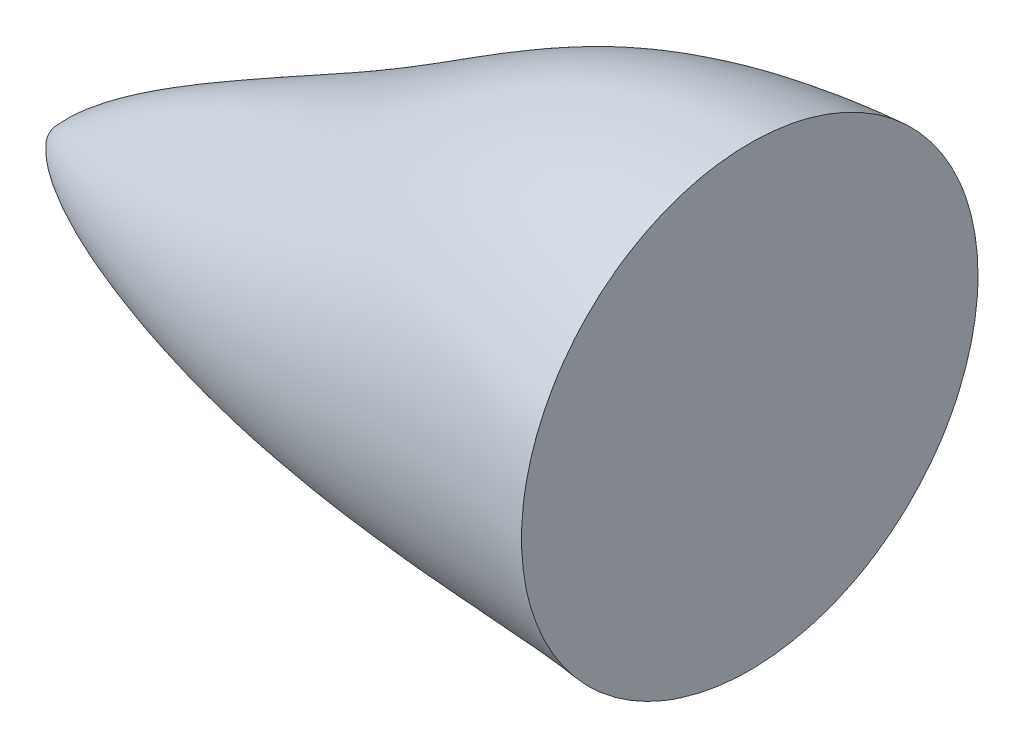
ISO-10303-21;
HEADER;
FILE_DESCRIPTION(('STEP AP214'),'2;1');
FILE_NAME('part.step','',(''),(''),'','','');
FILE_SCHEMA(('AUTOMOTIVE_DESIGN { 1 0 10303 214 1 1 1 1 }'));
ENDSEC;
DATA;
#1=APPLICATION_CONTEXT('core data for automotive mechanical design processes');
#2=APPLICATION_PROTOCOL_DEFINITION('international standard','automotive_design',2000,#1);
#3=PRODUCT_CONTEXT('',#1,'mechanical');
#4=PRODUCT('Part','Part','',(#3));
#5=PRODUCT_RELATED_PRODUCT_CATEGORY('part','',(#4));
#6=PRODUCT_DEFINITION_FORMATION('','',#4);
#7=PRODUCT_DEFINITION_CONTEXT('part definition',#1,'design');
#8=PRODUCT_DEFINITION('design','',#6,#7);
#9=PRODUCT_DEFINITION_SHAPE('','',#8);
#10=(LENGTH_UNIT() NAMED_UNIT(*) SI_UNIT(.MILLI.,.METRE.));
#11=(NAMED_UNIT(*) PLANE_ANGLE_UNIT() SI_UNIT($,.RADIAN.));
#12=(NAMED_UNIT(*) SI_UNIT($,.STERADIAN.) SOLID_ANGLE_UNIT());
#13=UNCERTAINTY_MEASURE_WITH_UNIT(LENGTH_MEASURE(1.E-05),#10,'distance_accuracy_value','');
#14=(GEOMETRIC_REPRESENTATION_CONTEXT(3) GLOBAL_UNCERTAINTY_ASSIGNED_CONTEXT((#13)) GLOBAL_UNIT_ASSIGNED_CONTEXT((#10,
#11,#12)) REPRESENTATION_CONTEXT('',''));
#15=CARTESIAN_POINT('',(0.,0.,0.));
#16=DIRECTION('',(0.,0.,1.));
#17=DIRECTION('',(1.,0.,0.));
#18=AXIS2_PLACEMENT_3D('',#15,#16,#17);
#19=CARTESIAN_POINT('',(252.505080353612,41.444975046652,-0.0242900524774977));
#20=DIRECTION('',(1.,0.,0.));
#21=DIRECTION('',(0.,0.,-1.));
#22=AXIS2_PLACEMENT_3D('',#19,#20,#21);
#23=PLANE('',#22);
#24=CARTESIAN_POINT('',(252.505080353612,41.444975046652,-0.0242900524774977));
#25=DIRECTION('',(1.,0.,0.));
#26=DIRECTION('',(0.,0.,-1.));
#27=AXIS2_PLACEMENT_3D('',#24,#25,#26);
#28=CIRCLE('',#27,80.2554933957984);
#29=CARTESIAN_POINT('',(252.505080353612,41.444975046652,-80.2797834482759));
#30=VERTEX_POINT('',#29);
#31=EDGE_CURVE('E12',#30,#30,#28,.T.);
#32=ORIENTED_EDGE('',*,*,#31,.T.);
#33=EDGE_LOOP('',(#32));
#34=FACE_BOUND('',#33,.T.);
#35=ADVANCED_FACE('F133',(#34),#23,.T.);
#36=CARTESIAN_POINT('',(14.0004930090321,1.55127443899315,-0.0242900524774881));
#37=DIRECTION('',(0.,0.,1.));
#38=DIRECTION('',(1.,0.,0.));
#39=AXIS2_PLACEMENT_3D('',#36,#37,#38);
#40=SPHERICAL_SURFACE('',#39,6.4149126554202);
#41=CARTESIAN_POINT('',(8.79208035361189,5.29607643476394,-0.0242900526618124));
#42=CARTESIAN_POINT('',(8.79208035361189,5.29607643476394,0.207305923801027));
#43=CARTESIAN_POINT('',(8.79208035361189,5.25264392995722,0.672071970209962));
#44=CARTESIAN_POINT('',(8.79208035361189,5.05907018495237,1.34952014911492));
#45=CARTESIAN_POINT('',(8.79208035361189,4.7389439787782,1.98284426504728));
#46=CARTESIAN_POINT('',(8.79208035361189,4.30350541356575,2.54901666698464));
#47=CARTESIAN_POINT('',(8.79208035361189,3.7639945914461,3.02500970390461));
#48=CARTESIAN_POINT('',(8.79208035361189,3.14013352681816,3.39289606316121));
#49=CARTESIAN_POINT('',(8.79208035361189,2.45164423408082,3.63474843210848));
#50=CARTESIAN_POINT('',(8.79208035361189,1.7246318865398,3.74093525600894));
#51=CARTESIAN_POINT('',(8.79208035361189,0.985201657500788,3.70182498012511));
#52=CARTESIAN_POINT('',(8.79208035361189,0.262431618430225,3.51851168750138));
#53=CARTESIAN_POINT('',(8.79208035361189,-0.414600159205438,3.19208946118217));
#54=CARTESIAN_POINT('',(8.79208035361189,-1.01834135006838,2.73532466143962));
#55=CARTESIAN_POINT('',(8.79208035361189,-1.52123962882078,2.16098364854588));
#56=CARTESIAN_POINT('',(8.79208035361189,-1.90181182807983,1.49271054716355));
#57=CARTESIAN_POINT('',(8.79208035361189,-2.13857478046271,0.754149481955265));
#58=CARTESIAN_POINT('',(8.79208035361189,-2.19352755677765,0.235978873552011));
#59=CARTESIAN_POINT('',(8.79208035361189,-2.19352755677765,-0.131666199893094));
#60=CARTESIAN_POINT('',(8.79208035361189,-2.18431323087303,-0.351624013182471));
#61=CARTESIAN_POINT('',(8.79208035361189,-2.13882265346838,-0.694097399983987));
#62=CARTESIAN_POINT('',(8.79208035361189,-2.05763687668219,-1.04602756514592));
#63=CARTESIAN_POINT('',(8.79208035361189,-1.89824610496449,-1.51994789294096));
#64=CARTESIAN_POINT('',(8.79208035361189,-1.59645912876083,-2.10625676020547));
#65=CARTESIAN_POINT('',(8.79208035361189,-1.07482462322609,-2.73486082252649));
#66=CARTESIAN_POINT('',(8.79208035361189,-0.440461498602304,-3.22815136226369));
#67=CARTESIAN_POINT('',(8.79208035361189,0.132552549983909,-3.5044893635251));
#68=CARTESIAN_POINT('',(8.79208035361189,0.585240357892667,-3.64795785868511));
#69=CARTESIAN_POINT('',(8.79208035361189,0.918625788228482,-3.7202835226138));
#70=CARTESIAN_POINT('',(8.79208035361189,1.2426120828529,-3.76085872458442));
#71=CARTESIAN_POINT('',(8.79208035361189,1.45015771538447,-3.76909204824829));
#72=CARTESIAN_POINT('',(8.79208035361189,1.83923442354722,-3.76909204824829));
#73=CARTESIAN_POINT('',(8.79208035361189,2.24240224192039,-3.72057843206245));
#74=CARTESIAN_POINT('',(8.79208035361189,2.7314976301406,-3.58471430635205));
#75=CARTESIAN_POINT('',(8.79208035361189,3.07522602557911,-3.45097329876752));
#76=CARTESIAN_POINT('',(8.79208035361189,3.39699898103635,-3.28913611664418));
#77=CARTESIAN_POINT('',(8.79208035361189,3.69649676759718,-3.1008397258113));
#78=CARTESIAN_POINT('',(8.79208035361189,3.97339965634645,-2.88772109209817));
#79=CARTESIAN_POINT('',(8.79208035361189,4.22738791836901,-2.6514171813341));
#80=CARTESIAN_POINT('',(8.79208035361189,4.45814182474972,-2.39356495934836));
#81=CARTESIAN_POINT('',(8.79208035361189,4.66454621770773,-2.11481001349433));
#82=CARTESIAN_POINT('',(8.79208035361189,4.84548593946219,-1.81579793112538));
#83=CARTESIAN_POINT('',(8.79208035361189,4.99984583223226,-1.49717429959488));
#84=CARTESIAN_POINT('',(8.79208035361189,5.12651073823709,-1.15958470625621));
#85=CARTESIAN_POINT('',(8.79208035361189,5.25351522183546,-0.683481160733875));
#86=CARTESIAN_POINT('',(8.79208035361189,5.29607643476394,-0.296388246895156));
#87=CARTESIAN_POINT('',(8.79208035361189,5.29607643476394,-0.0242900526618124));
#88=B_SPLINE_CURVE_WITH_KNOTS('',3,(#41,#42,#43,#44,#45,#46,#47,#48,#49,#50,#51,#52,#53,#54,#55,
#56,#57,#58,#59,#60,#61,#62,#63,#64,#65,#66,#67,#68,#69,#70,#71,#72,#73,#74,#75,#76,#77,#78,#79,
#80,#81,#82,#83,#84,#85,#86,#87),.UNSPECIFIED.,.T.,.F.,(4,1,1,1,1,1,1,1,1,1,1,1,1,1,1,1,2,1,1,1,
1,1,1,1,1,1,1,1,2,1,1,1,1,1,1,1,1,1,1,1,1,1,4),(0.,0.03125,0.0625,0.09375,0.125,0.15625,0.1875,
0.21875,0.25,0.28125,0.3125,0.34375,0.375,0.40625,0.4375,0.46875,0.5,0.512892451868856,
0.525784903737711,0.538677355606566,0.551569807475422,0.577354711213133,0.603139614950844,
0.628924518688555,0.654709422426266,0.667601874295122,0.680494326163977,0.693386778032833,
0.706279229901688,0.742994326163977,0.761351874295122,0.779709422426266,0.798066970557411,
0.816424518688555,0.8347820668197,0.853139614950844,0.871497163081989,0.889854711213133,
0.908212259344278,0.926569807475422,0.944927355606566,0.963284903737711,1.),.UNSPECIFIED.);
#89=CARTESIAN_POINT('',(8.79208035361189,1.55127443899315,-3.76909204824828));
#90=VERTEX_POINT('',#89);
#91=EDGE_CURVE('E143',#90,#90,#88,.T.);
#92=ORIENTED_EDGE('',*,*,#91,.F.);
#93=EDGE_LOOP('',(#92));
#94=FACE_BOUND('',#93,.T.);
#95=ADVANCED_FACE('F135',(#94),#40,.T.);
#96=CARTESIAN_POINT('',(8.79208035361189,5.29607643476394,-0.0242900526618124));
#97=CARTESIAN_POINT('',(22.0368216485564,20.1589542808384,-0.0242900524774881));
#98=CARTESIAN_POINT('',(54.6969178632129,39.2214785691004,-0.0242900524774881));
#99=CARTESIAN_POINT('',(91.0414597487698,56.8834706932842,-0.0242900524774881));
#100=CARTESIAN_POINT('',(106.021679072452,65.2347902173201,-0.0242900524774881));
#101=CARTESIAN_POINT('',(113.387790407563,69.4475607139392,-0.0242900524774881));
#102=CARTESIAN_POINT('',(128.983395481641,78.9700152689198,-0.0242900524774881));
#103=CARTESIAN_POINT('',(168.821290164312,104.734654201333,-0.0242900524774881));
#104=CARTESIAN_POINT('',(207.221534267085,121.81733907754,-0.0242900524774881));
#105=CARTESIAN_POINT('',(252.505080353612,121.70046844245,-0.0242900501067162));
#106=CARTESIAN_POINT('',(8.79208035361189,5.29607643476394,0.207305923801027));
#107=CARTESIAN_POINT('',(22.0368216485564,20.1589542808384,0.856432173165849));
#108=CARTESIAN_POINT('',(54.6969178632129,39.2214785691004,1.91126232808416));
#109=CARTESIAN_POINT('',(91.0414597487698,56.8834706932842,2.83414136751602));
#110=CARTESIAN_POINT('',(106.021679072452,65.2347902173201,3.20018250892833));
#111=CARTESIAN_POINT('',(113.387790407563,69.4475607139392,3.37855678942398));
#112=CARTESIAN_POINT('',(128.983395481641,78.9700152689198,3.7471938365309));
#113=CARTESIAN_POINT('',(168.821290164312,104.734654201333,4.60277571386178));
#114=CARTESIAN_POINT('',(207.221534267085,121.81733907754,5.10806134963034));
#115=CARTESIAN_POINT('',(252.505080353612,121.70046844245,5.48702557882752));
#116=CARTESIAN_POINT('',(8.79208035361189,5.25264392995722,0.672071970209962));
#117=CARTESIAN_POINT('',(21.9745662186552,19.9721168974318,2.6193077508435));
#118=CARTESIAN_POINT('',(54.6017836578803,38.839515431797,5.78356589407439));
#119=CARTESIAN_POINT('',(91.0036213619518,56.3242085306763,8.55021189977591));
#120=CARTESIAN_POINT('',(106.023486505561,64.5957796751024,9.64691381559775));
#121=CARTESIAN_POINT('',(113.410585249944,68.7686826622384,10.1812753535273));
#122=CARTESIAN_POINT('',(129.058063982592,78.2033052992709,11.2852158138743));
#123=CARTESIAN_POINT('',(169.044536058193,103.740318396779,13.8450581880084));
#124=CARTESIAN_POINT('',(207.471584337231,120.684102269237,15.3520020720883));
#125=CARTESIAN_POINT('',(252.505080353612,120.561344174218,16.4822099874981));
#126=CARTESIAN_POINT('',(8.79208035361189,5.05907018495237,1.34952014911492));
#127=CARTESIAN_POINT('',(21.7177625703131,19.1458042609468,5.16887569790878));
#128=CARTESIAN_POINT('',(54.2093550608844,37.141369188698,11.375328464404));
#129=CARTESIAN_POINT('',(90.847538016329,53.8389015665697,16.791644388973));
#130=CARTESIAN_POINT('',(106.030942167136,61.7603545291913,18.9350541057037));
#131=CARTESIAN_POINT('',(113.504613974767,65.758600566734,19.9790240815795));
#132=CARTESIAN_POINT('',(129.366071549019,74.8104438102853,22.1334862261693));
#133=CARTESIAN_POINT('',(169.965425370454,99.3645857461761,27.1159234827189));
#134=CARTESIAN_POINT('',(208.503040876579,115.716944613887,30.0212146350584));
#135=CARTESIAN_POINT('',(252.505080353611,115.556056973447,32.2001830015763));
#136=CARTESIAN_POINT('',(8.79208035361189,4.7389439787782,1.98284426504728));
#137=CARTESIAN_POINT('',(21.3208842046931,17.803734327545,7.52735170795148));
#138=CARTESIAN_POINT('',(53.6028745018897,34.3802989317061,16.5371763023818));
#139=CARTESIAN_POINT('',(90.6063183003653,49.8034119777684,24.3828097334953));
#140=CARTESIAN_POINT('',(106.042464553206,57.1624923900701,27.481498947623));
#141=CARTESIAN_POINT('',(113.649931094945,60.8806265314003,28.9900861943824));
#142=CARTESIAN_POINT('',(129.842083242587,69.3209062695076,32.0995545224449));
#143=CARTESIAN_POINT('',(171.388617943947,92.3158643082401,39.2680423606834));
#144=CARTESIAN_POINT('',(210.097110073756,107.7433465084,43.4011344208346));
#145=CARTESIAN_POINT('',(252.505080353612,107.51538923442,46.5009534680777));
#146=CARTESIAN_POINT('',(8.79208035361189,4.30350541356575,2.54901666698464));
#147=CARTESIAN_POINT('',(20.8072769080087,15.9978537914122,9.60531987309426));
#148=CARTESIAN_POINT('',(52.8180173078974,30.6601843769101,21.071812582741));
#149=CARTESIAN_POINT('',(90.294151609119,44.373658694234,31.0318570428224));
#150=CARTESIAN_POINT('',(106.057375876356,50.9837483186931,34.9568350666284));
#151=CARTESIAN_POINT('',(113.83798854459,54.3293439916712,36.8667375638911));
#152=CARTESIAN_POINT('',(130.458098375439,61.959159926574,40.7978170810524));
#153=CARTESIAN_POINT('',(173.230396568468,82.9022816209228,49.8276762584372));
#154=CARTESIAN_POINT('',(212.160023152453,97.1337031660424,54.9655175050415));
#155=CARTESIAN_POINT('',(252.505080353611,96.819578817059,58.8188984419516));
#156=CARTESIAN_POINT('',(8.79208035361189,3.7639945914461,3.02500970390461));
#157=CARTESIAN_POINT('',(20.2002864664724,13.7935534216604,11.3218793793662));
#158=CARTESIAN_POINT('',(51.890458805906,26.1201959370805,24.8042926017187));
#159=CARTESIAN_POINT('',(89.9252273376458,37.7594174314587,36.4832448767874));
#160=CARTESIAN_POINT('',(106.074998349169,43.466704484781,41.0741486897068));
#161=CARTESIAN_POINT('',(114.060238257805,46.3638366251744,43.3068410406453));
#162=CARTESIAN_POINT('',(131.18611625972,53.021228302599,47.8950494037268));
#163=CARTESIAN_POINT('',(175.407044033811,71.5191844664792,58.3916418336382));
#164=CARTESIAN_POINT('',(214.59801133637,84.3533977163556,64.2744170419421));
#165=CARTESIAN_POINT('',(252.505080353612,83.9496780015402,68.6864984499226));
#166=CARTESIAN_POINT('',(8.79208035361189,3.14013352681816,3.39289606316121));
#167=CARTESIAN_POINT('',(19.5232586662973,11.2740905819311,12.6110431849215));
#168=CARTESIAN_POINT('',(50.8558743229156,20.932620728193,27.5905322575194));
#169=CARTESIAN_POINT('',(89.5137348810024,30.2162907314106,40.528123984819));
#170=CARTESIAN_POINT('',(106.09465418423,34.9045876543897,45.6001616987292));
#171=CARTESIAN_POINT('',(114.308132168699,37.2961561776547,48.0653508392501));
#172=CARTESIAN_POINT('',(131.998136207571,42.8607642616786,53.122677814462));
#173=CARTESIAN_POINT('',(177.83484312977,58.6295436178635,64.6414005194024));
#174=CARTESIAN_POINT('',(217.317305849199,69.9396294669143,70.9894231578317));
#175=CARTESIAN_POINT('',(252.505080353612,69.4616993865726,75.7504401381783));
#176=CARTESIAN_POINT('',(8.79208035361189,2.45164423408082,3.63474843210848));
#177=CARTESIAN_POINT('',(18.7995392936966,8.53188433890053,13.419902175697));
#178=CARTESIAN_POINT('',(49.7499391859264,15.2937953366884,29.3207770087766));
#179=CARTESIAN_POINT('',(89.0738636342463,22.035337088769,43.0117200673144));
#180=CARTESIAN_POINT('',(106.115665594123,25.6300326091471,48.3639096767347));
#181=CARTESIAN_POINT('',(114.573122211379,27.4796261643819,50.9635938776696));
#182=CARTESIAN_POINT('',(132.866157531137,31.8761843684211,56.2871459336486));
#183=CARTESIAN_POINT('',(180.430076646141,44.7470887271925,68.3549957624447));
#184=CARTESIAN_POINT('',(220.224137914637,54.479517987699,74.8845602050128));
#185=CARTESIAN_POINT('',(252.505080353612,53.9609468707034,79.7817335382199));
#186=CARTESIAN_POINT('',(8.79208035361189,1.7246318865398,3.74093525600894));
#187=CARTESIAN_POINT('',(18.0524741348827,5.67061251827797,13.7165056552835));
#188=CARTESIAN_POINT('',(48.608328721937,9.41923795824644,29.926807553864));
#189=CARTESIAN_POINT('',(88.6198029924329,13.5321651642088,43.8399058491239));
#190=CARTESIAN_POINT('',(106.137354791431,16.0018012344426,49.2630474058589));
#191=CARTESIAN_POINT('',(114.846660319952,17.2944056824115,51.8954437133567));
#192=CARTESIAN_POINT('',(133.762179542559,20.4938575366789,57.2758071193624));
#193=CARTESIAN_POINT('',(183.109027372717,30.4140569968097,69.4122358357684));
#194=CARTESIAN_POINT('',(223.22473875638,38.5847898259359,75.8509336056077));
#195=CARTESIAN_POINT('',(252.505080353612,38.0744058999903,80.6799569340167));
#196=CARTESIAN_POINT('',(8.79208035361189,0.985201657500788,3.70182498012511));
#197=CARTESIAN_POINT('',(17.3054089760688,2.79741064494501,13.4845744022803));
#198=CARTESIAN_POINT('',(47.4667182579476,3.53354324887389,29.3815422130528));
#199=CARTESIAN_POINT('',(88.1657423506196,5.0342693293441,42.9819434378197));
#200=CARTESIAN_POINT('',(106.159043988739,6.39091093189193,48.2674345922908));
#201=CARTESIAN_POINT('',(115.120198428525,7.13300872962664,50.8312735959864));
#202=CARTESIAN_POINT('',(134.65820155398,9.15224479152814,56.0613838073754));
#203=CARTESIAN_POINT('',(185.787978099293,16.1814230186761,67.7988458573003));
#204=CARTESIAN_POINT('',(226.225339598123,22.86822923764,73.8976228171726));
#205=CARTESIAN_POINT('',(252.505080353612,22.4243598686579,78.471705537855));
#206=CARTESIAN_POINT('',(8.79208035361189,0.262431618430225,3.51851168750138));
#207=CARTESIAN_POINT('',(16.581689603468,0.0219920557761141,12.7320585502368));
#208=CARTESIAN_POINT('',(46.3607831209584,-2.1367583384523,27.7040722019627));
#209=CARTESIAN_POINT('',(87.7258711038635,-3.13137160817288,40.4724453133659));
#210=CARTESIAN_POINT('',(106.180055398633,-2.83377649201879,45.4198802149974));
#211=CARTESIAN_POINT('',(115.385188471205,-2.61507798820823,47.8181082333009));
#212=CARTESIAN_POINT('',(135.526222877546,-1.71544158460178,52.7008963211129));
#213=CARTESIAN_POINT('',(188.383211615663,2.58729472142365,63.6025681970041));
#214=CARTESIAN_POINT('',(229.132171663561,7.92014334996818,69.1461321067786));
#215=CARTESIAN_POINT('',(252.505080353611,7.60340719292589,73.3038050396439));
#216=CARTESIAN_POINT('',(8.79208035361189,-0.414600159205438,3.19208946118217));
#217=CARTESIAN_POINT('',(15.9046618032929,-2.54877482529745,11.4827839812719));
#218=CARTESIAN_POINT('',(45.3261986379679,-7.37260424723108,24.9551625762086));
#219=CARTESIAN_POINT('',(87.31437864722,-10.6511351541591,36.4089628762583));
#220=CARTESIAN_POINT('',(106.199711233693,-11.319742585418,40.8341050784654));
#221=CARTESIAN_POINT('',(115.633082382099,-11.5782374619175,42.9777193069627));
#222=CARTESIAN_POINT('',(136.338242825397,-11.6974231716899,47.3337476467477));
#223=CARTESIAN_POINT('',(190.811010711623,-9.86232826603562,57.0095483595909));
#224=CARTESIAN_POINT('',(231.851466176391,-5.71256035471374,61.8222978080387));
#225=CARTESIAN_POINT('',(252.505080353612,-5.84772186458018,65.4318598946812));
#226=CARTESIAN_POINT('',(8.79208035361189,-1.01834135006838,2.73532466143962));
#227=CARTESIAN_POINT('',(15.2976713617567,-4.81507490042071,9.78448666788476));
#228=CARTESIAN_POINT('',(44.3986401359766,-11.9709675644527,21.239374928158));
#229=CARTESIAN_POINT('',(86.9454543757468,-17.2368349458739,30.9491155334055));
#230=CARTESIAN_POINT('',(106.217333706506,-18.7441783622788,34.6899533729851));
#231=CARTESIAN_POINT('',(115.855332095315,-19.4167037249652,36.5009094594995));
#232=CARTESIAN_POINT('',(137.066260709678,-20.4185411284423,40.1741301288329));
#233=CARTESIAN_POINT('',(192.987658176966,-20.7111421830181,48.2926172280757));
#234=CARTESIAN_POINT('',(234.289454360307,-17.54456332619,52.2426176950414));
#235=CARTESIAN_POINT('',(252.505080353612,-17.4588057713263,55.205118045368));
#236=CARTESIAN_POINT('',(8.79208035361189,-1.52123962882078,2.16098364854588));
#237=CARTESIAN_POINT('',(14.7840640650722,-6.68587957130097,7.6985195108074));
#238=CARTESIAN_POINT('',(43.6137829419842,-15.7518859384583,16.6970152867898));
#239=CARTESIAN_POINT('',(86.6332876845005,-22.636737050366,24.3033642043615));
#240=CARTESIAN_POINT('',(106.232245029656,-24.8263538694235,27.2260925243857));
#241=CARTESIAN_POINT('',(116.043389544959,-25.8355660962865,28.6401327006831));
#242=CARTESIAN_POINT('',(137.682275842531,-27.5544285404941,31.5032294261359));
#243=CARTESIAN_POINT('',(194.829436801487,-29.5685810104953,37.8010494938086));
#244=CARTESIAN_POINT('',(236.352367439005,-27.1675347413668,40.7994946641135));
#245=CARTESIAN_POINT('',(252.505080353612,-26.8450482110005,43.0483285417717));
#246=CARTESIAN_POINT('',(8.79208035361189,-1.90181182807983,1.49271054716355));
#247=CARTESIAN_POINT('',(14.3871856994523,-8.0860070527018,5.30617113257298));
#248=CARTESIAN_POINT('',(43.0073023829897,-18.567132520185,11.5030445836766));
#249=CARTESIAN_POINT('',(86.392067968537,-26.6453750620919,16.7278562473524));
#250=CARTESIAN_POINT('',(106.243767415726,-29.3377934492912,18.7305993717441));
#251=CARTESIAN_POINT('',(116.188706665138,-30.5951097871097,19.6989958449177));
#252=CARTESIAN_POINT('',(138.158287536098,-32.8421338428605,21.6565766375514));
#253=CARTESIAN_POINT('',(196.25262937498,-36.12075102179,25.9434694737301));
#254=CARTESIAN_POINT('',(237.946436636181,-34.2605329920634,27.9426421178506));
#255=CARTESIAN_POINT('',(252.505080353612,-33.7170797741251,29.4420216007367));
#256=CARTESIAN_POINT('',(8.79208035361189,-2.13857478046271,0.754149481955265));
#257=CARTESIAN_POINT('',(14.1303820511101,-8.95373661265602,2.69792191580472));
#258=CARTESIAN_POINT('',(42.6148737859935,-20.3038157254014,5.85655212062719));
#259=CARTESIAN_POINT('',(86.2359846229139,-29.1112840750204,8.51336024059382));
#260=CARTESIAN_POINT('',(106.251223077301,-32.1112598465995,9.52942371208681));
#261=CARTESIAN_POINT('',(116.28273538996,-33.5203669051262,10.020464453456));
#262=CARTESIAN_POINT('',(138.466295102525,-36.0905983664946,11.0115598753504));
#263=CARTESIAN_POINT('',(197.173518687241,-40.1416222056402,13.1728013750961));
#264=CARTESIAN_POINT('',(238.97789317553,-38.598636263349,14.1605498688448));
#265=CARTESIAN_POINT('',(252.505080353612,-37.8876679028486,14.9013612388657));
#266=CARTESIAN_POINT('',(8.79208035361189,-2.19352755677765,0.235978873552011));
#267=CARTESIAN_POINT('',(14.0681266212089,-9.15153290162613,0.883844856905754));
#268=CARTESIAN_POINT('',(42.519739580661,-20.695825548608,1.9366270796736));
#269=CARTESIAN_POINT('',(86.1981462360961,-29.6654686776614,2.82128415528785));
#270=CARTESIAN_POINT('',(106.25303051041,-32.7341316721994,3.15929197583481));
#271=CARTESIAN_POINT('',(116.305530232341,-34.1771664260303,3.32260774507428));
#272=CARTESIAN_POINT('',(138.540963603477,-36.8197704426047,3.65202785705499));
#273=CARTESIAN_POINT('',(197.396764581122,-41.0438740773254,4.36912399325872));
#274=CARTESIAN_POINT('',(239.227943245675,-39.5688234878882,4.69407988993723));
#275=CARTESIAN_POINT('',(252.505080353612,-38.8105183491463,4.9377968121345));
#276=CARTESIAN_POINT('',(8.79208035361189,-2.19352755677765,-0.131666199893094));
#277=CARTESIAN_POINT('',(14.0681266212089,-9.15153290162613,-0.398948791986319));
#278=CARTESIAN_POINT('',(42.519739580661,-20.695825548608,-0.833283004319797));
#279=CARTESIAN_POINT('',(86.1981462360961,-29.6654686776614,-1.19825576488938));
#280=CARTESIAN_POINT('',(106.25303051041,-32.7341316721994,-1.33770375073573));
#281=CARTESIAN_POINT('',(116.305530232341,-34.1771664260303,-1.40508105295476));
#282=CARTESIAN_POINT('',(138.540963603477,-36.8197704426047,-1.54098610698178));
#283=CARTESIAN_POINT('',(197.396764581122,-41.0438740773254,-1.83683018446495));
#284=CARTESIAN_POINT('',(239.227943245675,-39.5688234878882,-1.97089348870266));
#285=CARTESIAN_POINT('',(252.505080353612,-38.8105183491463,-2.07144096719256));
#286=CARTESIAN_POINT('',(8.79208035361189,-2.18431323087303,-0.351624013182471));
#287=CARTESIAN_POINT('',(14.1719297973805,-9.12293016923063,-1.16897980759839));
#288=CARTESIAN_POINT('',(42.6415617886513,-20.6330798439165,-2.47109709848756));
#289=CARTESIAN_POINT('',(86.2357548495017,-29.5715345770848,-3.54644817912673));
#290=CARTESIAN_POINT('',(106.251224492249,-32.628154292302,-3.95452427768742));
#291=CARTESIAN_POINT('',(116.283990838578,-34.0652555500797,-4.15121110928516));
#292=CARTESIAN_POINT('',(138.47686622839,-36.6962042558687,-4.54661017996767));
#293=CARTESIAN_POINT('',(197.234309799777,-40.9007360246316,-5.4073108224472));
#294=CARTESIAN_POINT('',(239.073557555498,-39.4203432600995,-5.76133415780867));
#295=CARTESIAN_POINT('',(252.505080353612,-38.6553128743962,-6.00319761880562));
#296=CARTESIAN_POINT('',(8.79208035361189,-2.13882265346838,-0.694097399983987));
#297=CARTESIAN_POINT('',(14.6001178990884,-8.98969538069406,-2.36829046557489));
#298=CARTESIAN_POINT('',(43.144078396611,-20.3465303158922,-4.95696623656659));
#299=CARTESIAN_POINT('',(86.3908903798001,-29.1518855128296,-7.04424357205201));
#300=CARTESIAN_POINT('',(106.243774667334,-32.1593305111035,-7.83034385808784));
#301=CARTESIAN_POINT('',(116.195140839306,-33.5724655299672,-8.20804648678141));
#302=CARTESIAN_POINT('',(138.212464556158,-36.1577869186629,-8.96488181946288));
#303=CARTESIAN_POINT('',(196.564183826732,-40.2946140249674,-10.62128842719));
#304=CARTESIAN_POINT('',(238.43671658352,-38.8168749393315,-11.2120206041908));
#305=CARTESIAN_POINT('',(252.505080353612,-38.0426205232851,-11.5338427779697));
#306=CARTESIAN_POINT('',(8.79208035361189,-2.05763687668219,-1.04602756514592));
#307=CARTESIAN_POINT('',(15.2618631471823,-8.76262286549907,-3.59536887052635));
#308=CARTESIAN_POINT('',(43.9206949725488,-19.8660215320782,-7.44526952581778));
#309=CARTESIAN_POINT('',(86.6306452902611,-28.4579396382162,-10.4941677853851));
#310=CARTESIAN_POINT('',(106.232261301556,-31.3886583579273,-11.6372731604955));
#311=CARTESIAN_POINT('',(116.057827204068,-32.7646792193199,-12.1853202392405));
#312=CARTESIAN_POINT('',(137.803843789982,-35.2807604333542,-13.2818181633259));
#313=CARTESIAN_POINT('',(195.52853459566,-39.3230553469651,-15.6992406760861));
#314=CARTESIAN_POINT('',(237.452507808642,-37.8727666633259,-16.4676439340448));
#315=CARTESIAN_POINT('',(252.505080353611,-37.1017688740717,-16.7719249082141));
#316=CARTESIAN_POINT('',(8.79208035361189,-1.89824610496449,-1.51994789294096));
#317=CARTESIAN_POINT('',(16.4036980850699,-8.33224365620159,-5.24463233331228));
#318=CARTESIAN_POINT('',(45.2607392604414,-18.9674527989915,-10.7319381533206));
#319=CARTESIAN_POINT('',(87.0443400377233,-27.1741360925726,-15.0001591148047));
#320=CARTESIAN_POINT('',(106.212395101782,-29.9692510542573,-16.595303754263));
#321=CARTESIAN_POINT('',(115.820893872676,-31.2800970106975,-17.3586140194871));
#322=CARTESIAN_POINT('',(137.09877266403,-33.6764875952603,-18.8849553529195));
#323=CARTESIAN_POINT('',(193.741532000872,-37.5652239443105,-22.2846784814202));
#324=CARTESIAN_POINT('',(235.754265216699,-36.1937846957533,-23.2436556090109));
#325=CARTESIAN_POINT('',(252.505080353613,-35.4520192107699,-23.4306725362108));
#326=CARTESIAN_POINT('',(8.79208035361189,-1.59645912876083,-2.10625676020547));
#327=CARTESIAN_POINT('',(18.220253668073,-7.55094303230951,-7.28694355927417));
#328=CARTESIAN_POINT('',(47.3926279002707,-17.3637273332841,-14.7197933902445));
#329=CARTESIAN_POINT('',(87.7024907723224,-24.9114680329418,-20.4012803044218));
#330=CARTESIAN_POINT('',(106.180789783959,-27.4801553030729,-22.522984287444));
#331=CARTESIAN_POINT('',(115.443954481826,-28.6830539464423,-23.5369191454403));
#332=CARTESIAN_POINT('',(135.977068600016,-30.8847843681886,-25.5667825978991));
#333=CARTESIAN_POINT('',(190.898573327343,-34.5398930823636,-30.1526364407332));
#334=CARTESIAN_POINT('',(233.052515638605,-33.3555570074275,-31.3137583222306));
#335=CARTESIAN_POINT('',(252.505080353611,-32.7065431289588,-31.2384381002345));
#336=CARTESIAN_POINT('',(8.79208035361189,-1.07482462322609,-2.73486082252649));
#337=CARTESIAN_POINT('',(20.7115298961914,-6.23951812886336,-9.56171257523027));
#338=CARTESIAN_POINT('',(50.3163608920364,-14.712639250331,-19.130022637183));
#339=CARTESIAN_POINT('',(88.6050974940582,-21.2156049738397,-26.35710668553));
#340=CARTESIAN_POINT('',(106.137445348089,-23.4330625158136,-29.0668435153406));
#341=CARTESIAN_POINT('',(114.927009031517,-24.4701062895923,-30.3621882754185));
#342=CARTESIAN_POINT('',(134.43873159794,-26.3770761262997,-32.9653220566053));
#343=CARTESIAN_POINT('',(186.999658575077,-29.6825239970028,-38.9342942325919));
#344=CARTESIAN_POINT('',(229.347259074363,-28.8468078608679,-40.3855373462849));
#345=CARTESIAN_POINT('',(252.505080353612,-28.3940121611384,-39.9601110683772));
#346=CARTESIAN_POINT('',(8.79208035361189,-0.440461498602304,-3.22815136226369));
#347=CARTESIAN_POINT('',(23.2028061243099,-4.60449945677237,-11.5213740407427));
#348=CARTESIAN_POINT('',(53.2400938838023,-11.399987996745,-22.9906478294547));
#349=CARTESIAN_POINT('',(89.5077042157941,-16.618551259916,-31.6357664758309));
#350=CARTESIAN_POINT('',(106.094100912219,-18.4089878265868,-34.9035867146388));
#351=CARTESIAN_POINT('',(114.410063581208,-19.2458999331289,-36.4690781280786));
#352=CARTESIAN_POINT('',(132.900394595864,-20.7984758528035,-39.6319153452336));
#353=CARTESIAN_POINT('',(183.100743822809,-23.6541846068792,-46.9492038342726));
#354=CARTESIAN_POINT('',(225.64200251012,-23.2437043451079,-48.8145608720346));
#355=CARTESIAN_POINT('',(252.505080353611,-23.0445887757895,-48.1320230571203));
#356=CARTESIAN_POINT('',(8.79208035361189,0.132552549983909,-3.5044893635251));
#357=CARTESIAN_POINT('',(25.0193617073129,-3.02893955853771,-12.8014565696538));
#358=CARTESIAN_POINT('',(55.3719825236315,-8.16379209361037,-25.6255273714984));
#359=CARTESIAN_POINT('',(90.1658549503931,-12.1229347147536,-35.3584846837957));
#360=CARTESIAN_POINT('',(106.062495594397,-13.4943332375906,-39.0744929848584));
#361=CARTESIAN_POINT('',(114.033124190357,-14.1358002951873,-40.8606474829409));
#362=CARTESIAN_POINT('',(131.77869053185,-15.3392825267487,-44.4887894967663));
#363=CARTESIAN_POINT('',(180.257785149282,-17.6892625901064,-52.8918633882278));
#364=CARTESIAN_POINT('',(222.940252932028,-17.6247907611129,-55.2544927293387));
#365=CARTESIAN_POINT('',(252.505080353612,-17.6376057426768,-54.5309634273101));
#366=CARTESIAN_POINT('',(8.79208035361189,0.585240357892667,-3.64795785868511));
#367=CARTESIAN_POINT('',(26.1611966452005,-1.67868849503588,-13.572477962205));
#368=CARTESIAN_POINT('',(56.7120268115242,-5.34122682516808,-27.3168011658149));
#369=CARTESIAN_POINT('',(90.5795496978554,-8.1824219406676,-37.8659360675431));
#370=CARTESIAN_POINT('',(106.042629394623,-9.1774455456086,-41.9330164106852));
#371=CARTESIAN_POINT('',(113.796190858966,-9.64351963873683,-43.8948997872028));
#372=CARTESIAN_POINT('',(131.073619405899,-10.528167578136,-47.8984227320765));
#373=CARTESIAN_POINT('',(178.470782554492,-12.3481976571007,-57.1363716369616));
#374=CARTESIAN_POINT('',(221.242010340083,-12.4868822746691,-60.0131449459191));
#375=CARTESIAN_POINT('',(252.505080353612,-12.6221598191136,-59.415029170582));
#376=CARTESIAN_POINT('',(8.79208035361189,0.918625788228482,-3.7202835226138));
#377=CARTESIAN_POINT('',(26.8229418932945,-0.628611704202959,-14.0164486424393));
#378=CARTESIAN_POINT('',(57.4886433874619,-3.12304403643308,-28.362393167573));
#379=CARTESIAN_POINT('',(90.8193046083164,-5.07251250787744,-39.4966283130855));
#380=CARTESIAN_POINT('',(106.031116028845,-5.76333941770557,-43.8236165621596));
#381=CARTESIAN_POINT('',(113.658877223727,-6.08752167056831,-45.9171971865231));
#382=CARTESIAN_POINT('',(130.664998639722,-6.71004428989312,-50.2043646527172));
#383=CARTESIAN_POINT('',(177.435133323422,-8.0512927202578,-60.0474858594717));
#384=CARTESIAN_POINT('',(220.257801565206,-8.27658602124282,-63.3726913075136));
#385=CARTESIAN_POINT('',(252.505080353612,-8.45948890354436,-62.9601051261618));
#386=CARTESIAN_POINT('',(8.79208035361189,1.2426120828529,-3.76085872458442));
#387=CARTESIAN_POINT('',(27.2511299950024,0.450763306820309,-14.3183975678991));
#388=CARTESIAN_POINT('',(57.9911599954217,-0.820662979493816,-29.1706958790561));
#389=CARTESIAN_POINT('',(90.9744401386149,-1.82635704400757,-40.8629537418169));
#390=CARTESIAN_POINT('',(106.023666203929,-2.188897585246,-45.4467296823014));
#391=CARTESIAN_POINT('',(113.570027224456,-2.35954816834547,-47.6721720143621));
#392=CARTESIAN_POINT('',(130.40059696749,-2.69242423116801,-52.2455278758494));
#393=CARTESIAN_POINT('',(176.765007350375,-3.4499061341419,-62.6683235090019));
#394=CARTESIAN_POINT('',(219.620960593227,-3.659974660857,-66.5088690822401));
#395=CARTESIAN_POINT('',(252.505080353612,-3.82024467294085,-66.3852150763379));
#396=CARTESIAN_POINT('',(8.79208035361189,1.45015771538447,-3.76909204824829));
#397=CARTESIAN_POINT('',(27.354933171174,1.18358068172695,-14.4199344136585));
#398=CARTESIAN_POINT('',(58.1129822034119,0.756641623420332,-29.5419370506251));
#399=CARTESIAN_POINT('',(91.0120487520205,0.41514717188191,-41.5880416129743));
#400=CARTESIAN_POINT('',(106.021860185768,0.290275652966324,-46.3410128675269));
#401=CARTESIAN_POINT('',(113.548487830693,0.231328498704895,-48.6545925533046));
#402=CARTESIAN_POINT('',(130.336499592404,0.114952130656669,-53.4205695310412));
#403=CARTESIAN_POINT('',(176.602552569031,-0.159701723492578,-64.2091998619589));
#404=CARTESIAN_POINT('',(219.46657490305,-0.256489468693455,-68.4397715380224));
#405=CARTESIAN_POINT('',(252.505080353612,-0.329080279001561,-68.5849830684035));
#406=CARTESIAN_POINT('',(8.79208035361189,1.83923442354722,-3.76909204824829));
#407=CARTESIAN_POINT('',(27.354933171174,2.5983919175298,-14.5145247899588));
#408=CARTESIAN_POINT('',(58.1129822034119,3.81422803491917,-30.0861005860052));
#409=CARTESIAN_POINT('',(91.0120487520205,4.78673518784942,-42.7952584097847));
#410=CARTESIAN_POINT('',(106.021860185768,5.14234402657458,-47.8717630979705));
#411=CARTESIAN_POINT('',(113.548487830693,5.31021360368153,-50.3551674352752));
#412=CARTESIAN_POINT('',(130.336499592404,5.64162997032843,-55.4933938840604));
#413=CARTESIAN_POINT('',(176.602552569031,6.42378861605961,-66.961689079426));
#414=CARTESIAN_POINT('',(219.46657490305,6.69942054536271,-71.987905731217));
#415=CARTESIAN_POINT('',(252.505080353612,6.90614449093259,-72.7298509933937));
#416=CARTESIAN_POINT('',(8.79208035361189,2.24240224192039,-3.72057843206245));
#417=CARTESIAN_POINT('',(27.2302899323626,4.22740151972177,-14.4682734586459));
#418=CARTESIAN_POINT('',(58.0329181954384,7.29592265048321,-30.3392922834616));
#419=CARTESIAN_POINT('',(91.0127380722567,9.79838045671597,-43.5969976192892));
#420=CARTESIAN_POINT('',(106.021855940925,10.754452059123,-48.9543767171424));
#421=CARTESIAN_POINT('',(113.544721484838,11.2117494914944,-51.5861442691944));
#422=CARTESIAN_POINT('',(130.304786214808,12.140456429683,-57.0569087477426));
#423=CARTESIAN_POINT('',(176.42017923142,14.394484887393,-69.1978098359081));
#424=CARTESIAN_POINT('',(219.179581763145,15.3427048767275,-75.0943338351084));
#425=CARTESIAN_POINT('',(252.505080353612,15.7508491417545,-76.5599717302865));
#426=CARTESIAN_POINT('',(8.79208035361189,2.7314976301406,-3.58471430635205));
#427=CARTESIAN_POINT('',(26.8771340890638,6.42834395616527,-14.1090527715443));
#428=CARTESIAN_POINT('',(57.8060701728472,11.9247833201602,-29.9521716748387));
#429=CARTESIAN_POINT('',(91.0146911462597,16.5316261891295,-43.5190578002471));
#430=CARTESIAN_POINT('',(106.021843913869,18.3835421797645,-49.0684952538873));
#431=CARTESIAN_POINT('',(113.534050171583,19.2819164196513,-51.8049725975756));
#432=CARTESIAN_POINT('',(130.214931644952,21.1616878195748,-57.5250003203535));
#433=CARTESIAN_POINT('',(175.903454774857,25.8728171841156,-70.2508423321862));
#434=CARTESIAN_POINT('',(218.366434533413,28.2196161339685,-77.1093718851965));
#435=CARTESIAN_POINT('',(252.505080353612,28.8181358969459,-79.4975732926579));
#436=CARTESIAN_POINT('',(8.79208035361189,3.07522602557911,-3.45097329876752));
#437=CARTESIAN_POINT('',(26.5343651823326,8.07139374807549,-13.6952623034011));
#438=CARTESIAN_POINT('',(57.5858941509205,15.3440962713938,-29.3064614027649));
#439=CARTESIAN_POINT('',(91.0165867769097,21.5381120659734,-42.8886023180045));
#440=CARTESIAN_POINT('',(106.02183224055,24.0964378781509,-48.4861443009215));
#441=CARTESIAN_POINT('',(113.523692720483,25.3463462502053,-51.2521761650035));
#442=CARTESIAN_POINT('',(130.127719856563,28.0003787236838,-57.0550423867561));
#443=CARTESIAN_POINT('',(175.401928096428,34.7576778772771,-70.0265300548084));
#444=CARTESIAN_POINT('',(217.577203398672,38.3753076429125,-77.4585136238818));
#445=CARTESIAN_POINT('',(252.505080353611,39.0936435224189,-80.4719513801128));
#446=CARTESIAN_POINT('',(8.79208035361189,3.39699898103635,-3.28913611664418));
#447=CARTESIAN_POINT('',(26.1292746561957,9.68511920529486,-13.1408302935423));
#448=CARTESIAN_POINT('',(57.3256861250067,18.6666367308503,-28.3106134020224));
#449=CARTESIAN_POINT('',(91.0188270676776,26.4328002949375,-41.6866898431794));
#450=CARTESIAN_POINT('',(106.021818444809,29.7183209510088,-47.2326395834902));
#451=CARTESIAN_POINT('',(113.511452096456,31.3332645518028,-49.9773611070336));
#452=CARTESIAN_POINT('',(130.024651379376,34.8051199149471,-55.7534143074411));
#453=CARTESIAN_POINT('',(174.809214749194,43.7640118682535,-68.7461803467344));
#454=CARTESIAN_POINT('',(216.644475693981,48.8397442642576,-76.5629815705364));
#455=CARTESIAN_POINT('',(252.505080353612,49.6668397584494,-80.0956594657582));
#456=CARTESIAN_POINT('',(8.79208035361189,3.69649676759718,-3.1008397258113));
#457=CARTESIAN_POINT('',(25.6774429155046,11.2485182894716,-12.4525983589451));
#458=CARTESIAN_POINT('',(57.0354540961031,21.8520793990063,-26.9814471809911));
#459=CARTESIAN_POINT('',(91.0213258535342,31.1501387094287,-39.932660582086));
#460=CARTESIAN_POINT('',(106.021803057251,35.1678431041081,-45.3263491538807));
#461=CARTESIAN_POINT('',(113.497799092733,37.1529300350123,-47.9983577398928));
#462=CARTESIAN_POINT('',(129.909690385591,41.4653927267721,-53.6351458144327));
#463=CARTESIAN_POINT('',(174.148111400355,52.7198940427419,-66.3996068985282));
#464=CARTESIAN_POINT('',(215.604125561823,59.3866845665465,-74.3750341721621));
#465=CARTESIAN_POINT('',(252.505080353611,60.30862352641,-78.2839192986191));
#466=CARTESIAN_POINT('',(8.79208035361189,3.97339965634645,-2.88772109209817));
#467=CARTESIAN_POINT('',(25.1944503651106,12.7411874742789,-11.6359436396326));
#468=CARTESIAN_POINT('',(56.725206065206,24.8616700704041,-25.3319379960455));
#469=CARTESIAN_POINT('',(91.0239969694498,35.6253983695665,-37.6438404180199));
#470=CARTESIAN_POINT('',(106.021786608483,40.3636176796391,-42.7857349348051));
#471=CARTESIAN_POINT('',(113.483204502546,42.7150818488188,-45.334267675845));
#472=CARTESIAN_POINT('',(129.786801047406,47.8688091480213,-50.719840669834));
#473=CARTESIAN_POINT('',(173.441414717114,61.4463140854379,-62.9939599172299));
#474=CARTESIAN_POINT('',(214.49202714469,69.7753968535847,-70.8823855690134));
#475=CARTESIAN_POINT('',(252.505080353612,70.7698496851349,-75.0009977035546));
#476=CARTESIAN_POINT('',(8.79208035361189,4.22738791836901,-2.6514171813341));
#477=CARTESIAN_POINT('',(24.6958774098652,14.1451065794436,-10.7001624688134));
#478=CARTESIAN_POINT('',(56.4049500333124,27.6629108229769,-23.3853489856728));
#479=CARTESIAN_POINT('',(91.0267542503951,39.8011478627668,-34.8551466190837));
#480=CARTESIAN_POINT('',(106.02176962911,45.23113909757,-39.6503588755918));
#481=CARTESIAN_POINT('',(113.468139119128,47.9360472275689,-42.0270687687877));
#482=CARTESIAN_POINT('',(129.659947537022,53.9084420928166,-47.0540344976005));
#483=CARTESIAN_POINT('',(172.711921366671,69.7640482912581,-58.5749902943173));
#484=CARTESIAN_POINT('',(213.344054585067,79.7552357181955,-66.1229255673228));
#485=CARTESIAN_POINT('',(252.505080353611,80.7841841415726,-70.2700184075582));
#486=CARTESIAN_POINT('',(8.79208035361189,4.45814182474972,-2.39356495934836));
#487=CARTESIAN_POINT('',(24.1973044546198,15.4420654519014,-9.65265075075955));
#488=CARTESIAN_POINT('',(56.0846940014187,30.2228050560805,-21.1599546624011));
#489=CARTESIAN_POINT('',(91.0295115313403,43.6196944773073,-31.5988824977689));
#490=CARTESIAN_POINT('',(106.021752649737,49.6959139547941,-35.9599047397578));
#491=CARTESIAN_POINT('',(113.45307373571,52.7323183188613,-38.1203886136871));
#492=CARTESIAN_POINT('',(129.533094026638,59.4779578210879,-42.6901985692874));
#493=CARTESIAN_POINT('',(171.982428016229,77.4961218579892,-53.2109462487087));
#494=CARTESIAN_POINT('',(212.196082025446,89.0801550860849,-60.1805542742868));
#495=CARTESIAN_POINT('',(252.505080353612,90.0916549580647,-64.1777501687294));
#496=CARTESIAN_POINT('',(8.79208035361189,4.66454621770773,-2.11481001349433));
#497=CARTESIAN_POINT('',(23.7143119042258,16.6159930043687,-8.50318655988832));
#498=CARTESIAN_POINT('',(55.7744459705218,32.5152637886525,-18.6818937254137));
#499=CARTESIAN_POINT('',(91.0321826472561,47.0344916253222,-27.9221292633003));
#500=CARTESIAN_POINT('',(106.021736200969,53.6962995732192,-31.7723246143012));
#501=CARTESIAN_POINT('',(113.438479145523,57.0340712085867,-33.6779052756451));
#502=CARTESIAN_POINT('',(129.410204688453,64.4864432605987,-37.7050082823135));
#503=CARTESIAN_POINT('',(171.275731332988,84.4850980762583,-47.0066793639686));
#504=CARTESIAN_POINT('',(211.083983608312,97.5262583990489,-53.188825538791));
#505=CARTESIAN_POINT('',(252.505080353611,98.4563982804796,-56.8704032696391));
#506=CARTESIAN_POINT('',(8.79208035361189,4.84548593946219,-1.81579793112538));
#507=CARTESIAN_POINT('',(23.2624801635347,17.6495998713788,-7.25999412104662));
#508=CARTESIAN_POINT('',(55.4842139416181,34.5110000593999,-15.9732260187713));
#509=CARTESIAN_POINT('',(91.0346814331127,49.9973170314044,-23.8698308738196));
#510=CARTESIAN_POINT('',(106.021720813412,57.1707313642651,-27.1456701852742));
#511=CARTESIAN_POINT('',(113.4248261418,60.7725395562781,-28.7646456991673));
#512=CARTESIAN_POINT('',(129.295243694668,68.8467904116591,-32.179992203451));
#513=CARTESIAN_POINT('',(170.61462798415,90.5879622456757,-40.0854357355029));
#514=CARTESIAN_POINT('',(210.043633476156,104.899144201161,-45.3189126571043));
#515=CARTESIAN_POINT('',(252.505080353613,105.683350176934,-48.5462261418977));
#516=CARTESIAN_POINT('',(8.79208035361189,4.99984583223226,-1.49717429959488));
#517=CARTESIAN_POINT('',(22.8573896373978,18.5286419957923,-5.93405439678205));
#518=CARTESIAN_POINT('',(55.2240059157047,36.1887208413882,-13.0632478229988));
#519=CARTESIAN_POINT('',(91.0369217238808,52.4743486175139,-19.4986445646021));
#520=CARTESIAN_POINT('',(106.021707017671,60.0753196846274,-22.1516790736144));
#521=CARTESIAN_POINT('',(113.412585517773,63.8983074471087,-23.4603054426927));
#522=CARTESIAN_POINT('',(129.192175217481,72.4951658512624,-26.2135022693033));
#523=CARTESIAN_POINT('',(170.021914636915,95.6967876835004,-32.5930122767087));
#524=CARTESIAN_POINT('',(209.110905771462,111.052093164792,-36.7694303149378));
#525=CARTESIAN_POINT('',(252.505080353611,111.63457442683,-39.4345765351464));
#526=CARTESIAN_POINT('',(8.79208035361189,5.12651073823709,-1.15958470625621));
#527=CARTESIAN_POINT('',(22.5146207306666,19.2372650626473,-4.53566909712174));
#528=CARTESIAN_POINT('',(55.0038298937777,37.5229061808996,-9.97947238075535));
#529=CARTESIAN_POINT('',(91.0388173545306,54.4295494674826,-14.864293289244));
#530=CARTESIAN_POINT('',(106.021695344352,62.3662781057266,-16.8621324391638));
#531=CARTESIAN_POINT('',(113.402228066673,66.363356813027,-17.8451697161636));
#532=CARTESIAN_POINT('',(129.104963429092,75.372765506773,-19.9060119394182));
#533=CARTESIAN_POINT('',(169.520387958486,99.7227099811925,-24.6832469100798));
#534=CARTESIAN_POINT('',(208.321674636723,115.877371080675,-27.7554382290658));
#535=CARTESIAN_POINT('',(252.505080353612,116.226062061047,-29.7875602465642));
#536=CARTESIAN_POINT('',(8.79208035361189,5.25351522183546,-0.683481160733875));
#537=CARTESIAN_POINT('',(22.1614648873678,19.9355987067358,-2.59061883194504));
#538=CARTESIAN_POINT('',(54.7769818711864,38.8202843548621,-5.68135158211464));
#539=CARTESIAN_POINT('',(91.0407704285335,56.3142269260825,-8.41951107623511));
#540=CARTESIAN_POINT('',(106.021683317295,64.5714912268152,-9.521768997528));
#541=CARTESIAN_POINT('',(113.391556753418,68.7351205052336,-10.0614808101149));
#542=CARTESIAN_POINT('',(129.015108859237,78.1401399037206,-11.1846513596121));
#543=CARTESIAN_POINT('',(169.003663501922,103.584891733088,-13.7879863525305));
#544=CARTESIAN_POINT('',(207.508527406991,120.474942491882,-15.393891042729));
#545=CARTESIAN_POINT('',(252.505080353612,120.5166169943,-16.5273574355626));
#546=CARTESIAN_POINT('',(8.79208035361189,5.29607643476394,-0.296388246895156));
#547=CARTESIAN_POINT('',(22.0368216485564,20.1589542808384,-1.05903569391213));
#548=CARTESIAN_POINT('',(54.6969178632129,39.2214785691004,-2.29833779561424));
#549=CARTESIAN_POINT('',(91.0414597487698,56.8834706932842,-3.38261276429232));
#550=CARTESIAN_POINT('',(106.021679072452,65.2347902173201,-3.81266830806547));
#551=CARTESIAN_POINT('',(113.387790407563,69.4475607139392,-4.02223723219713));
#552=CARTESIAN_POINT('',(128.983395481641,78.9700152689198,-4.45534266164917));
#553=CARTESIAN_POINT('',(168.821290164312,104.734654201333,-5.46055133321632));
#554=CARTESIAN_POINT('',(207.221534267085,121.81733907754,-6.05420287744655));
#555=CARTESIAN_POINT('',(252.505080353612,121.70046844245,-6.49944153324844));
#556=CARTESIAN_POINT('',(8.79208035361189,5.29607643476394,-0.0242900526618124));
#557=CARTESIAN_POINT('',(22.0368216485564,20.1589542808384,-0.0242900524774881));
#558=CARTESIAN_POINT('',(54.6969178632129,39.2214785691004,-0.0242900524774881));
#559=CARTESIAN_POINT('',(91.0414597487698,56.8834706932842,-0.0242900524774881));
#560=CARTESIAN_POINT('',(106.021679072452,65.2347902173201,-0.0242900524774881));
#561=CARTESIAN_POINT('',(113.387790407563,69.4475607139392,-0.0242900524774881));
#562=CARTESIAN_POINT('',(128.983395481641,78.9700152689198,-0.0242900524774881));
#563=CARTESIAN_POINT('',(168.821290164312,104.734654201333,-0.0242900524774881));
#564=CARTESIAN_POINT('',(207.221534267085,121.81733907754,-0.0242900524774881));
#565=CARTESIAN_POINT('',(252.505080353612,121.70046844245,-0.0242900501067162));
#566=B_SPLINE_SURFACE_WITH_KNOTS('',3,3,((#96,#97,#98,#99,#100,#101,#102,#103,#104,#105),(#106,
#107,#108,#109,#110,#111,#112,#113,#114,#115),(#116,#117,#118,#119,#120,#121,#122,#123,#124,
#125),(#126,#127,#128,#129,#130,#131,#132,#133,#134,#135),(#136,#137,#138,#139,#140,#141,#142,
#143,#144,#145),(#146,#147,#148,#149,#150,#151,#152,#153,#154,#155),(#156,#157,#158,#159,#160,
#161,#162,#163,#164,#165),(#166,#167,#168,#169,#170,#171,#172,#173,#174,#175),(#176,#177,#178,
#179,#180,#181,#182,#183,#184,#185),(#186,#187,#188,#189,#190,#191,#192,#193,#194,#195),(#196,
#197,#198,#199,#200,#201,#202,#203,#204,#205),(#206,#207,#208,#209,#210,#211,#212,#213,#214,
#215),(#216,#217,#218,#219,#220,#221,#222,#223,#224,#225),(#226,#227,#228,#229,#230,#231,#232,
#233,#234,#235),(#236,#237,#238,#239,#240,#241,#242,#243,#244,#245),(#246,#247,#248,#249,#250,
#251,#252,#253,#254,#255),(#256,#257,#258,#259,#260,#261,#262,#263,#264,#265),(#266,#267,#268,
#269,#270,#271,#272,#273,#274,#275),(#276,#277,#278,#279,#280,#281,#282,#283,#284,#285),(#286,
#287,#288,#289,#290,#291,#292,#293,#294,#295),(#296,#297,#298,#299,#300,#301,#302,#303,#304,
#305),(#306,#307,#308,#309,#310,#311,#312,#313,#314,#315),(#316,#317,#318,#319,#320,#321,#322,
#323,#324,#325),(#326,#327,#328,#329,#330,#331,#332,#333,#334,#335),(#336,#337,#338,#339,#340,
#341,#342,#343,#344,#345),(#346,#347,#348,#349,#350,#351,#352,#353,#354,#355),(#356,#357,#358,
#359,#360,#361,#362,#363,#364,#365),(#366,#367,#368,#369,#370,#371,#372,#373,#374,#375),(#376,
#377,#378,#379,#380,#381,#382,#383,#384,#385),(#386,#387,#388,#389,#390,#391,#392,#393,#394,
#395),(#396,#397,#398,#399,#400,#401,#402,#403,#404,#405),(#406,#407,#408,#409,#410,#411,#412,
#413,#414,#415),(#416,#417,#418,#419,#420,#421,#422,#423,#424,#425),(#426,#427,#428,#429,#430,
#431,#432,#433,#434,#435),(#436,#437,#438,#439,#440,#441,#442,#443,#444,#445),(#446,#447,#448,
#449,#450,#451,#452,#453,#454,#455),(#456,#457,#458,#459,#460,#461,#462,#463,#464,#465),(#466,
#467,#468,#469,#470,#471,#472,#473,#474,#475),(#476,#477,#478,#479,#480,#481,#482,#483,#484,
#485),(#486,#487,#488,#489,#490,#491,#492,#493,#494,#495),(#496,#497,#498,#499,#500,#501,#502,
#503,#504,#505),(#506,#507,#508,#509,#510,#511,#512,#513,#514,#515),(#516,#517,#518,#519,#520,
#521,#522,#523,#524,#525),(#526,#527,#528,#529,#530,#531,#532,#533,#534,#535),(#536,#537,#538,
#539,#540,#541,#542,#543,#544,#545),(#546,#547,#548,#549,#550,#551,#552,#553,#554,#555),(#556,
#557,#558,#559,#560,#561,#562,#563,#564,#565)),.UNSPECIFIED.,.T.,.F.,.F.,(4,1,1,1,1,1,1,1,1,1,1,
1,1,1,1,1,2,1,1,1,1,1,1,1,1,1,1,1,2,1,1,1,1,1,1,1,1,1,1,1,1,1,4),(4,1,1,1,1,1,1,4),(0.,0.03125,
0.0625,0.09375,0.125,0.15625,0.1875,0.21875,0.25,0.28125,0.3125,0.34375,0.375,0.40625,0.4375,
0.46875,0.5,0.512892451868856,0.525784903737711,0.538677355606566,0.551569807475422,
0.577354711213133,0.603139614950844,0.628924518688555,0.654709422426266,0.667601874295122,
0.680494326163977,0.693386778032833,0.706279229901688,0.742994326163977,0.761351874295122,
0.779709422426266,0.798066970557411,0.816424518688555,0.8347820668197,0.853139614950844,
0.871497163081989,0.889854711213133,0.908212259344278,0.926569807475422,0.944927355606566,
0.963284903737711,1.),(0.,0.25,0.40625,0.417465182914885,0.4375,0.5,0.625,1.),.UNSPECIFIED.);
#567=ORIENTED_EDGE('',*,*,#91,.T.);
#568=EDGE_LOOP('',(#567));
#569=FACE_BOUND('',#568,.T.);
#570=ORIENTED_EDGE('',*,*,#31,.F.);
#571=EDGE_LOOP('',(#570));
#572=FACE_BOUND('',#571,.T.);
#573=ADVANCED_FACE('F161',(#569,#572),#566,.T.);
#574=CLOSED_SHELL('',(#35,#95,#573));
#575=MANIFOLD_SOLID_BREP('B2',#574);
#576=ADVANCED_BREP_SHAPE_REPRESENTATION('',(#18,#575),#14);
#577=SHAPE_DEFINITION_REPRESENTATION(#9,#576);
ENDSEC;
END-ISO-10303-21;
